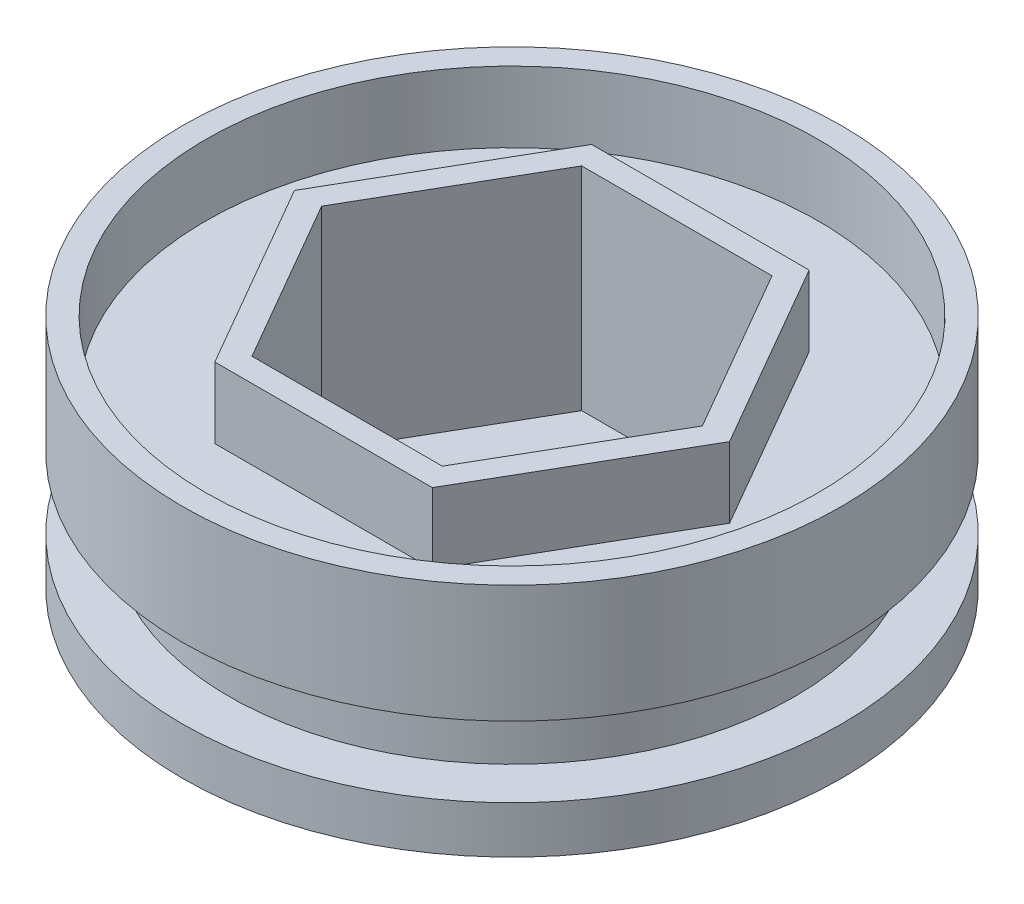
ISO-10303-21;
HEADER;
FILE_DESCRIPTION(('STEP AP214'),'2;1');
FILE_NAME('part.step','',(''),(''),'','','');
FILE_SCHEMA(('AUTOMOTIVE_DESIGN { 1 0 10303 214 1 1 1 1 }'));
ENDSEC;
DATA;
#1=APPLICATION_CONTEXT('core data for automotive mechanical design processes');
#2=APPLICATION_PROTOCOL_DEFINITION('international standard','automotive_design',2000,#1);
#3=PRODUCT_CONTEXT('',#1,'mechanical');
#4=PRODUCT('Part','Part','',(#3));
#5=PRODUCT_RELATED_PRODUCT_CATEGORY('part','',(#4));
#6=PRODUCT_DEFINITION_FORMATION('','',#4);
#7=PRODUCT_DEFINITION_CONTEXT('part definition',#1,'design');
#8=PRODUCT_DEFINITION('design','',#6,#7);
#9=PRODUCT_DEFINITION_SHAPE('','',#8);
#10=(LENGTH_UNIT() NAMED_UNIT(*) SI_UNIT(.MILLI.,.METRE.));
#11=(NAMED_UNIT(*) PLANE_ANGLE_UNIT() SI_UNIT($,.RADIAN.));
#12=(NAMED_UNIT(*) SI_UNIT($,.STERADIAN.) SOLID_ANGLE_UNIT());
#13=UNCERTAINTY_MEASURE_WITH_UNIT(LENGTH_MEASURE(1.E-05),#10,'distance_accuracy_value','');
#14=(GEOMETRIC_REPRESENTATION_CONTEXT(3) GLOBAL_UNCERTAINTY_ASSIGNED_CONTEXT((#13)) GLOBAL_UNIT_ASSIGNED_CONTEXT((#10,
#11,#12)) REPRESENTATION_CONTEXT('',''));
#15=CARTESIAN_POINT('',(0.,0.,0.));
#16=DIRECTION('',(0.,0.,1.));
#17=DIRECTION('',(1.,0.,0.));
#18=AXIS2_PLACEMENT_3D('',#15,#16,#17);
#19=CARTESIAN_POINT('',(0.,9.99999999999996,0.));
#20=DIRECTION('',(0.,-1.,0.));
#21=DIRECTION('',(0.,0.,-1.));
#22=AXIS2_PLACEMENT_3D('',#19,#20,#21);
#23=CYLINDRICAL_SURFACE('',#22,14.);
#24=CARTESIAN_POINT('',(0.,9.99999999999996,0.));
#25=DIRECTION('',(0.,1.,0.));
#26=DIRECTION('',(0.,0.,1.));
#27=AXIS2_PLACEMENT_3D('',#24,#25,#26);
#28=CIRCLE('',#27,14.);
#29=CARTESIAN_POINT('',(0.,9.99999999999996,14.));
#30=VERTEX_POINT('',#29);
#31=EDGE_CURVE('E13',#30,#30,#28,.T.);
#32=ORIENTED_EDGE('',*,*,#31,.F.);
#33=EDGE_LOOP('',(#32));
#34=FACE_BOUND('',#33,.T.);
#35=CARTESIAN_POINT('',(0.,4.99999999999996,0.));
#36=DIRECTION('',(0.,1.,0.));
#37=DIRECTION('',(1.,0.,0.));
#38=AXIS2_PLACEMENT_3D('',#35,#36,#37);
#39=CIRCLE('',#38,14.);
#40=CARTESIAN_POINT('',(14.,4.99999999999997,0.));
#41=VERTEX_POINT('',#40);
#42=EDGE_CURVE('E154',#41,#41,#39,.T.);
#43=ORIENTED_EDGE('',*,*,#42,.T.);
#44=EDGE_LOOP('',(#43));
#45=FACE_BOUND('',#44,.T.);
#46=ADVANCED_FACE('F52',(#34,#45),#23,.T.);
#47=CARTESIAN_POINT('',(0.,6.99999999999996,0.));
#48=DIRECTION('',(0.,1.,0.));
#49=DIRECTION('',(0.,0.,1.));
#50=AXIS2_PLACEMENT_3D('',#47,#48,#49);
#51=PLANE('',#50);
#52=CARTESIAN_POINT('',(0.,6.99999999999996,0.));
#53=DIRECTION('',(0.,1.,0.));
#54=DIRECTION('',(0.,0.,1.));
#55=AXIS2_PLACEMENT_3D('',#52,#53,#54);
#56=CIRCLE('',#55,13.);
#57=CARTESIAN_POINT('',(0.,6.99999999999996,13.));
#58=VERTEX_POINT('',#57);
#59=EDGE_CURVE('E259',#58,#58,#56,.T.);
#60=ORIENTED_EDGE('',*,*,#59,.T.);
#61=EDGE_LOOP('',(#60));
#62=FACE_BOUND('',#61,.T.);
#63=DIRECTION('',(-0.5,0.,-0.866025403784439));
#64=VECTOR('',#63,1.);
#65=CARTESIAN_POINT('',(9.23760430703402,6.99999999999996,0.));
#66=LINE('',#65,#64);
#67=CARTESIAN_POINT('',(9.23760430703402,6.99999999999996,0.));
#68=VERTEX_POINT('',#67);
#69=CARTESIAN_POINT('',(4.61880215351702,6.99999999999996,-8.));
#70=VERTEX_POINT('',#69);
#71=EDGE_CURVE('E233',#68,#70,#66,.T.);
#72=ORIENTED_EDGE('',*,*,#71,.F.);
#73=DIRECTION('',(0.500000000000002,0.,-0.866025403784441));
#74=VECTOR('',#73,1.);
#75=CARTESIAN_POINT('',(4.61880215351701,6.99999999999998,8.00000000000001));
#76=LINE('',#75,#74);
#77=CARTESIAN_POINT('',(4.61880215351701,6.99999999999998,8.00000000000001));
#78=VERTEX_POINT('',#77);
#79=EDGE_CURVE('E205',#78,#68,#76,.T.);
#80=ORIENTED_EDGE('',*,*,#79,.F.);
#81=DIRECTION('',(1.,0.,0.));
#82=VECTOR('',#81,1.);
#83=CARTESIAN_POINT('',(-4.61880215351707,6.99999999999998,8.00000000000005));
#84=LINE('',#83,#82);
#85=CARTESIAN_POINT('',(-4.61880215351707,6.99999999999998,8.00000000000005));
#86=VERTEX_POINT('',#85);
#87=EDGE_CURVE('E220',#86,#78,#84,.T.);
#88=ORIENTED_EDGE('',*,*,#87,.F.);
#89=DIRECTION('',(0.5,0.,0.866025403784439));
#90=VECTOR('',#89,1.);
#91=CARTESIAN_POINT('',(-9.23760430703406,6.99999999999996,0.));
#92=LINE('',#91,#90);
#93=CARTESIAN_POINT('',(-9.23760430703406,6.99999999999996,0.));
#94=VERTEX_POINT('',#93);
#95=EDGE_CURVE('E239',#94,#86,#92,.T.);
#96=ORIENTED_EDGE('',*,*,#95,.F.);
#97=DIRECTION('',(-0.500000000000002,0.,0.866025403784441));
#98=VECTOR('',#97,1.);
#99=CARTESIAN_POINT('',(-4.61880215351704,6.99999999999996,-7.99999999999999));
#100=LINE('',#99,#98);
#101=CARTESIAN_POINT('',(-4.61880215351704,6.99999999999996,-7.99999999999999));
#102=VERTEX_POINT('',#101);
#103=EDGE_CURVE('E237',#102,#94,#100,.T.);
#104=ORIENTED_EDGE('',*,*,#103,.F.);
#105=DIRECTION('',(-1.,0.,0.));
#106=VECTOR('',#105,1.);
#107=CARTESIAN_POINT('',(4.61880215351702,6.99999999999996,-8.));
#108=LINE('',#107,#106);
#109=EDGE_CURVE('E235',#70,#102,#108,.T.);
#110=ORIENTED_EDGE('',*,*,#109,.F.);
#111=EDGE_LOOP('',(#72,#80,#88,#96,#104,#110));
#112=FACE_BOUND('',#111,.T.);
#113=ADVANCED_FACE('F270',(#62,#112),#51,.T.);
#114=CARTESIAN_POINT('',(0.,9.99999999999996,0.));
#115=DIRECTION('',(0.,1.,0.));
#116=DIRECTION('',(0.,0.,1.));
#117=AXIS2_PLACEMENT_3D('',#114,#115,#116);
#118=PLANE('',#117);
#119=CARTESIAN_POINT('',(0.,9.99999999999996,0.));
#120=DIRECTION('',(0.,1.,0.));
#121=DIRECTION('',(0.,0.,1.));
#122=AXIS2_PLACEMENT_3D('',#119,#120,#121);
#123=CIRCLE('',#122,13.);
#124=CARTESIAN_POINT('',(0.,9.99999999999996,13.));
#125=VERTEX_POINT('',#124);
#126=EDGE_CURVE('E258',#125,#125,#123,.T.);
#127=ORIENTED_EDGE('',*,*,#126,.F.);
#128=EDGE_LOOP('',(#127));
#129=FACE_BOUND('',#128,.T.);
#130=ORIENTED_EDGE('',*,*,#31,.T.);
#131=EDGE_LOOP('',(#130));
#132=FACE_BOUND('',#131,.T.);
#133=ADVANCED_FACE('F267',(#129,#132),#118,.T.);
#134=CARTESIAN_POINT('',(0.,6.99999999999996,0.));
#135=DIRECTION('',(0.,1.,0.));
#136=DIRECTION('',(0.,0.,1.));
#137=AXIS2_PLACEMENT_3D('',#134,#135,#136);
#138=CYLINDRICAL_SURFACE('',#137,13.);
#139=ORIENTED_EDGE('',*,*,#59,.F.);
#140=EDGE_LOOP('',(#139));
#141=FACE_BOUND('',#140,.T.);
#142=ORIENTED_EDGE('',*,*,#126,.T.);
#143=EDGE_LOOP('',(#142));
#144=FACE_BOUND('',#143,.T.);
#145=ADVANCED_FACE('F265',(#141,#144),#138,.F.);
#146=CARTESIAN_POINT('',(4.61880215351701,9.99999999999998,8.00000000000001));
#147=DIRECTION('',(-0.86602540378444,0.,-0.499999999999999));
#148=DIRECTION('',(-0.500000000000002,0.,0.866025403784441));
#149=AXIS2_PLACEMENT_3D('',#146,#147,#148);
#150=PLANE('',#149);
#151=ORIENTED_EDGE('',*,*,#79,.T.);
#152=DIRECTION('',(0.,-1.,0.));
#153=VECTOR('',#152,1.);
#154=CARTESIAN_POINT('',(9.23760430703402,9.99999999999996,0.));
#155=LINE('',#154,#153);
#156=CARTESIAN_POINT('',(9.23760430703402,9.99999999999996,0.));
#157=VERTEX_POINT('',#156);
#158=EDGE_CURVE('E256',#157,#68,#155,.T.);
#159=ORIENTED_EDGE('',*,*,#158,.F.);
#160=DIRECTION('',(0.500000000000002,0.,-0.866025403784441));
#161=VECTOR('',#160,1.);
#162=CARTESIAN_POINT('',(4.61880215351701,9.99999999999998,8.00000000000001));
#163=LINE('',#162,#161);
#164=CARTESIAN_POINT('',(4.61880215351701,9.99999999999998,8.00000000000001));
#165=VERTEX_POINT('',#164);
#166=EDGE_CURVE('E216',#165,#157,#163,.T.);
#167=ORIENTED_EDGE('',*,*,#166,.F.);
#168=DIRECTION('',(0.,-1.,0.));
#169=VECTOR('',#168,1.);
#170=CARTESIAN_POINT('',(4.61880215351701,9.99999999999998,8.00000000000001));
#171=LINE('',#170,#169);
#172=EDGE_CURVE('E230',#165,#78,#171,.T.);
#173=ORIENTED_EDGE('',*,*,#172,.T.);
#174=EDGE_LOOP('',(#151,#159,#167,#173));
#175=FACE_BOUND('',#174,.T.);
#176=ADVANCED_FACE('F297',(#175),#150,.F.);
#177=CARTESIAN_POINT('',(9.23760430703402,9.99999999999996,0.));
#178=DIRECTION('',(-0.866025403784442,0.,0.500000000000002));
#179=DIRECTION('',(0.5,0.,0.866025403784439));
#180=AXIS2_PLACEMENT_3D('',#177,#178,#179);
#181=PLANE('',#180);
#182=ORIENTED_EDGE('',*,*,#71,.T.);
#183=DIRECTION('',(0.,-1.,0.));
#184=VECTOR('',#183,1.);
#185=CARTESIAN_POINT('',(4.61880215351702,9.99999999999996,-8.));
#186=LINE('',#185,#184);
#187=CARTESIAN_POINT('',(4.61880215351702,9.99999999999996,-8.));
#188=VERTEX_POINT('',#187);
#189=EDGE_CURVE('E253',#188,#70,#186,.T.);
#190=ORIENTED_EDGE('',*,*,#189,.F.);
#191=DIRECTION('',(-0.5,0.,-0.866025403784439));
#192=VECTOR('',#191,1.);
#193=CARTESIAN_POINT('',(9.23760430703402,9.99999999999996,0.));
#194=LINE('',#193,#192);
#195=EDGE_CURVE('E219',#157,#188,#194,.T.);
#196=ORIENTED_EDGE('',*,*,#195,.F.);
#197=ORIENTED_EDGE('',*,*,#158,.T.);
#198=EDGE_LOOP('',(#182,#190,#196,#197));
#199=FACE_BOUND('',#198,.T.);
#200=ADVANCED_FACE('F304',(#199),#181,.F.);
#201=CARTESIAN_POINT('',(4.61880215351702,9.99999999999996,-8.));
#202=DIRECTION('',(0.,0.,1.));
#203=DIRECTION('',(1.,0.,0.));
#204=AXIS2_PLACEMENT_3D('',#201,#202,#203);
#205=PLANE('',#204);
#206=ORIENTED_EDGE('',*,*,#109,.T.);
#207=DIRECTION('',(0.,-1.,0.));
#208=VECTOR('',#207,1.);
#209=CARTESIAN_POINT('',(-4.61880215351704,9.99999999999996,-7.99999999999999));
#210=LINE('',#209,#208);
#211=CARTESIAN_POINT('',(-4.61880215351704,9.99999999999996,-7.99999999999999));
#212=VERTEX_POINT('',#211);
#213=EDGE_CURVE('E250',#212,#102,#210,.T.);
#214=ORIENTED_EDGE('',*,*,#213,.F.);
#215=DIRECTION('',(-1.,0.,0.));
#216=VECTOR('',#215,1.);
#217=CARTESIAN_POINT('',(4.61880215351702,9.99999999999996,-8.));
#218=LINE('',#217,#216);
#219=EDGE_CURVE('E222',#188,#212,#218,.T.);
#220=ORIENTED_EDGE('',*,*,#219,.F.);
#221=ORIENTED_EDGE('',*,*,#189,.T.);
#222=EDGE_LOOP('',(#206,#214,#220,#221));
#223=FACE_BOUND('',#222,.T.);
#224=ADVANCED_FACE('F308',(#223),#205,.F.);
#225=CARTESIAN_POINT('',(-4.61880215351704,9.99999999999996,-7.99999999999999));
#226=DIRECTION('',(0.866025403784441,0.,0.499999999999999));
#227=DIRECTION('',(0.500000000000002,0.,-0.866025403784441));
#228=AXIS2_PLACEMENT_3D('',#225,#226,#227);
#229=PLANE('',#228);
#230=ORIENTED_EDGE('',*,*,#103,.T.);
#231=DIRECTION('',(0.,-1.,0.));
#232=VECTOR('',#231,1.);
#233=CARTESIAN_POINT('',(-9.23760430703402,9.99999999999996,0.));
#234=LINE('',#233,#232);
#235=CARTESIAN_POINT('',(-9.23760430703402,9.99999999999996,0.));
#236=VERTEX_POINT('',#235);
#237=EDGE_CURVE('E247',#236,#94,#234,.T.);
#238=ORIENTED_EDGE('',*,*,#237,.F.);
#239=DIRECTION('',(-0.500000000000002,0.,0.866025403784441));
#240=VECTOR('',#239,1.);
#241=CARTESIAN_POINT('',(-4.61880215351704,9.99999999999996,-7.99999999999999));
#242=LINE('',#241,#240);
#243=EDGE_CURVE('E224',#212,#236,#242,.T.);
#244=ORIENTED_EDGE('',*,*,#243,.F.);
#245=ORIENTED_EDGE('',*,*,#213,.T.);
#246=EDGE_LOOP('',(#230,#238,#244,#245));
#247=FACE_BOUND('',#246,.T.);
#248=ADVANCED_FACE('F312',(#247),#229,.F.);
#249=CARTESIAN_POINT('',(-9.23760430703402,9.99999999999996,0.));
#250=DIRECTION('',(0.866025403784442,0.,-0.500000000000002));
#251=DIRECTION('',(-0.500000000000001,0.,-0.86602540378444));
#252=AXIS2_PLACEMENT_3D('',#249,#250,#251);
#253=PLANE('',#252);
#254=ORIENTED_EDGE('',*,*,#95,.T.);
#255=DIRECTION('',(0.,-1.,0.));
#256=VECTOR('',#255,1.);
#257=CARTESIAN_POINT('',(-4.61880215351707,9.99999999999998,8.00000000000005));
#258=LINE('',#257,#256);
#259=CARTESIAN_POINT('',(-4.61880215351707,9.99999999999998,8.00000000000005));
#260=VERTEX_POINT('',#259);
#261=EDGE_CURVE('E245',#260,#86,#258,.T.);
#262=ORIENTED_EDGE('',*,*,#261,.F.);
#263=DIRECTION('',(0.5,0.,0.866025403784439));
#264=VECTOR('',#263,1.);
#265=CARTESIAN_POINT('',(-9.23760430703402,9.99999999999996,0.));
#266=LINE('',#265,#264);
#267=EDGE_CURVE('E226',#236,#260,#266,.T.);
#268=ORIENTED_EDGE('',*,*,#267,.F.);
#269=ORIENTED_EDGE('',*,*,#237,.T.);
#270=EDGE_LOOP('',(#254,#262,#268,#269));
#271=FACE_BOUND('',#270,.T.);
#272=ADVANCED_FACE('F316',(#271),#253,.F.);
#273=CARTESIAN_POINT('',(-4.61880215351707,9.99999999999998,8.00000000000005));
#274=DIRECTION('',(0.,0.,-1.));
#275=DIRECTION('',(-1.,0.,0.));
#276=AXIS2_PLACEMENT_3D('',#273,#274,#275);
#277=PLANE('',#276);
#278=ORIENTED_EDGE('',*,*,#87,.T.);
#279=ORIENTED_EDGE('',*,*,#172,.F.);
#280=DIRECTION('',(1.,0.,0.));
#281=VECTOR('',#280,1.);
#282=CARTESIAN_POINT('',(-4.61880215351707,9.99999999999998,8.00000000000005));
#283=LINE('',#282,#281);
#284=EDGE_CURVE('E228',#260,#165,#283,.T.);
#285=ORIENTED_EDGE('',*,*,#284,.F.);
#286=ORIENTED_EDGE('',*,*,#261,.T.);
#287=EDGE_LOOP('',(#278,#279,#285,#286));
#288=FACE_BOUND('',#287,.T.);
#289=ADVANCED_FACE('F320',(#288),#277,.F.);
#290=CARTESIAN_POINT('',(0.,9.99999999999996,0.));
#291=DIRECTION('',(0.,1.,0.));
#292=DIRECTION('',(0.,0.,1.));
#293=AXIS2_PLACEMENT_3D('',#290,#291,#292);
#294=PLANE('',#293);
#295=DIRECTION('',(0.500000000000002,0.,-0.86602540378444));
#296=VECTOR('',#295,1.);
#297=CARTESIAN_POINT('',(4.04145188432738,9.99999999999998,7.00000000000004));
#298=LINE('',#297,#296);
#299=CARTESIAN_POINT('',(4.04145188432738,9.99999999999998,7.00000000000004));
#300=VERTEX_POINT('',#299);
#301=CARTESIAN_POINT('',(8.08290376865477,9.99999999999996,0.));
#302=VERTEX_POINT('',#301);
#303=EDGE_CURVE('E166',#300,#302,#298,.T.);
#304=ORIENTED_EDGE('',*,*,#303,.F.);
#305=DIRECTION('',(1.,0.,0.));
#306=VECTOR('',#305,1.);
#307=CARTESIAN_POINT('',(-4.04145188432742,9.99999999999998,7.00000000000004));
#308=LINE('',#307,#306);
#309=CARTESIAN_POINT('',(-4.04145188432742,9.99999999999998,7.00000000000004));
#310=VERTEX_POINT('',#309);
#311=EDGE_CURVE('E172',#310,#300,#308,.T.);
#312=ORIENTED_EDGE('',*,*,#311,.F.);
#313=DIRECTION('',(0.500000000000001,0.,0.866025403784439));
#314=VECTOR('',#313,1.);
#315=CARTESIAN_POINT('',(-8.08290376865481,9.99999999999996,0.));
#316=LINE('',#315,#314);
#317=CARTESIAN_POINT('',(-8.08290376865481,9.99999999999996,0.));
#318=VERTEX_POINT('',#317);
#319=EDGE_CURVE('E198',#318,#310,#316,.T.);
#320=ORIENTED_EDGE('',*,*,#319,.F.);
#321=DIRECTION('',(-0.500000000000002,0.,0.866025403784441));
#322=VECTOR('',#321,1.);
#323=CARTESIAN_POINT('',(-4.04145188432742,9.99999999999996,-6.99999999999999));
#324=LINE('',#323,#322);
#325=CARTESIAN_POINT('',(-4.04145188432742,9.99999999999996,-6.99999999999999));
#326=VERTEX_POINT('',#325);
#327=EDGE_CURVE('E195',#326,#318,#324,.T.);
#328=ORIENTED_EDGE('',*,*,#327,.F.);
#329=DIRECTION('',(-1.,0.,0.));
#330=VECTOR('',#329,1.);
#331=CARTESIAN_POINT('',(4.04145188432738,9.99999999999996,-7.));
#332=LINE('',#331,#330);
#333=CARTESIAN_POINT('',(4.04145188432738,9.99999999999996,-7.));
#334=VERTEX_POINT('',#333);
#335=EDGE_CURVE('E192',#334,#326,#332,.T.);
#336=ORIENTED_EDGE('',*,*,#335,.F.);
#337=DIRECTION('',(-0.500000000000001,0.,-0.866025403784439));
#338=VECTOR('',#337,1.);
#339=CARTESIAN_POINT('',(8.08290376865477,9.99999999999996,0.));
#340=LINE('',#339,#338);
#341=EDGE_CURVE('E189',#302,#334,#340,.T.);
#342=ORIENTED_EDGE('',*,*,#341,.F.);
#343=EDGE_LOOP('',(#304,#312,#320,#328,#336,#342));
#344=FACE_BOUND('',#343,.T.);
#345=ORIENTED_EDGE('',*,*,#166,.T.);
#346=ORIENTED_EDGE('',*,*,#195,.T.);
#347=ORIENTED_EDGE('',*,*,#219,.T.);
#348=ORIENTED_EDGE('',*,*,#243,.T.);
#349=ORIENTED_EDGE('',*,*,#267,.T.);
#350=ORIENTED_EDGE('',*,*,#284,.T.);
#351=EDGE_LOOP('',(#345,#346,#347,#348,#349,#350));
#352=FACE_BOUND('',#351,.T.);
#353=ADVANCED_FACE('F324',(#344,#352),#294,.T.);
#354=CARTESIAN_POINT('',(4.04145188432738,1.,7.00000000000002));
#355=DIRECTION('',(0.86602540378444,0.,0.5));
#356=DIRECTION('',(0.500000000000002,0.,-0.866025403784441));
#357=AXIS2_PLACEMENT_3D('',#354,#355,#356);
#358=PLANE('',#357);
#359=ORIENTED_EDGE('',*,*,#303,.T.);
#360=DIRECTION('',(0.,1.,0.));
#361=VECTOR('',#360,1.);
#362=CARTESIAN_POINT('',(8.08290376865477,1.,0.));
#363=LINE('',#362,#361);
#364=CARTESIAN_POINT('',(8.08290376865477,1.,0.));
#365=VERTEX_POINT('',#364);
#366=EDGE_CURVE('E187',#365,#302,#363,.T.);
#367=ORIENTED_EDGE('',*,*,#366,.F.);
#368=DIRECTION('',(0.500000000000002,0.,-0.86602540378444));
#369=VECTOR('',#368,1.);
#370=CARTESIAN_POINT('',(4.04145188432738,1.,7.00000000000002));
#371=LINE('',#370,#369);
#372=CARTESIAN_POINT('',(4.04145188432738,1.,7.00000000000002));
#373=VERTEX_POINT('',#372);
#374=EDGE_CURVE('E168',#373,#365,#371,.T.);
#375=ORIENTED_EDGE('',*,*,#374,.F.);
#376=DIRECTION('',(0.,1.,0.));
#377=VECTOR('',#376,1.);
#378=CARTESIAN_POINT('',(4.04145188432738,1.,7.00000000000002));
#379=LINE('',#378,#377);
#380=EDGE_CURVE('E203',#373,#300,#379,.T.);
#381=ORIENTED_EDGE('',*,*,#380,.T.);
#382=EDGE_LOOP('',(#359,#367,#375,#381));
#383=FACE_BOUND('',#382,.T.);
#384=ADVANCED_FACE('F328',(#383),#358,.F.);
#385=CARTESIAN_POINT('',(-4.04145188432743,0.999999999999959,7.00000000000004));
#386=DIRECTION('',(0.,0.,1.));
#387=DIRECTION('',(1.,0.,0.));
#388=AXIS2_PLACEMENT_3D('',#385,#386,#387);
#389=PLANE('',#388);
#390=ORIENTED_EDGE('',*,*,#311,.T.);
#391=ORIENTED_EDGE('',*,*,#380,.F.);
#392=DIRECTION('',(1.,0.,0.));
#393=VECTOR('',#392,1.);
#394=CARTESIAN_POINT('',(-4.04145188432743,0.999999999999959,7.00000000000004));
#395=LINE('',#394,#393);
#396=CARTESIAN_POINT('',(-4.04145188432743,0.999999999999959,7.00000000000004));
#397=VERTEX_POINT('',#396);
#398=EDGE_CURVE('E184',#397,#373,#395,.T.);
#399=ORIENTED_EDGE('',*,*,#398,.F.);
#400=DIRECTION('',(0.,1.,0.));
#401=VECTOR('',#400,1.);
#402=CARTESIAN_POINT('',(-4.04145188432743,0.999999999999959,7.00000000000004));
#403=LINE('',#402,#401);
#404=EDGE_CURVE('E206',#397,#310,#403,.T.);
#405=ORIENTED_EDGE('',*,*,#404,.T.);
#406=EDGE_LOOP('',(#390,#391,#399,#405));
#407=FACE_BOUND('',#406,.T.);
#408=ADVANCED_FACE('F332',(#407),#389,.F.);
#409=CARTESIAN_POINT('',(-8.08290376865481,0.999999999999959,0.));
#410=DIRECTION('',(-0.866025403784442,0.,0.500000000000002));
#411=DIRECTION('',(0.500000000000001,0.,0.86602540378444));
#412=AXIS2_PLACEMENT_3D('',#409,#410,#411);
#413=PLANE('',#412);
#414=ORIENTED_EDGE('',*,*,#319,.T.);
#415=ORIENTED_EDGE('',*,*,#404,.F.);
#416=DIRECTION('',(0.500000000000001,0.,0.866025403784439));
#417=VECTOR('',#416,1.);
#418=CARTESIAN_POINT('',(-8.08290376865481,0.999999999999959,0.));
#419=LINE('',#418,#417);
#420=CARTESIAN_POINT('',(-8.08290376865481,0.999999999999959,0.));
#421=VERTEX_POINT('',#420);
#422=EDGE_CURVE('E181',#421,#397,#419,.T.);
#423=ORIENTED_EDGE('',*,*,#422,.F.);
#424=DIRECTION('',(0.,1.,0.));
#425=VECTOR('',#424,1.);
#426=CARTESIAN_POINT('',(-8.08290376865481,0.999999999999959,0.));
#427=LINE('',#426,#425);
#428=EDGE_CURVE('E208',#421,#318,#427,.T.);
#429=ORIENTED_EDGE('',*,*,#428,.T.);
#430=EDGE_LOOP('',(#414,#415,#423,#429));
#431=FACE_BOUND('',#430,.T.);
#432=ADVANCED_FACE('F346',(#431),#413,.F.);
#433=CARTESIAN_POINT('',(-4.04145188432742,1.,-6.99999999999999));
#434=DIRECTION('',(-0.866025403784441,0.,-0.499999999999999));
#435=DIRECTION('',(-0.500000000000002,0.,0.866025403784441));
#436=AXIS2_PLACEMENT_3D('',#433,#434,#435);
#437=PLANE('',#436);
#438=ORIENTED_EDGE('',*,*,#327,.T.);
#439=ORIENTED_EDGE('',*,*,#428,.F.);
#440=DIRECTION('',(-0.500000000000002,0.,0.866025403784441));
#441=VECTOR('',#440,1.);
#442=CARTESIAN_POINT('',(-4.04145188432742,1.,-6.99999999999999));
#443=LINE('',#442,#441);
#444=CARTESIAN_POINT('',(-4.04145188432742,1.,-6.99999999999999));
#445=VERTEX_POINT('',#444);
#446=EDGE_CURVE('E178',#445,#421,#443,.T.);
#447=ORIENTED_EDGE('',*,*,#446,.F.);
#448=DIRECTION('',(0.,1.,0.));
#449=VECTOR('',#448,1.);
#450=CARTESIAN_POINT('',(-4.04145188432742,1.,-6.99999999999999));
#451=LINE('',#450,#449);
#452=EDGE_CURVE('E210',#445,#326,#451,.T.);
#453=ORIENTED_EDGE('',*,*,#452,.T.);
#454=EDGE_LOOP('',(#438,#439,#447,#453));
#455=FACE_BOUND('',#454,.T.);
#456=ADVANCED_FACE('F342',(#455),#437,.F.);
#457=CARTESIAN_POINT('',(4.04145188432738,1.,-7.));
#458=DIRECTION('',(0.,0.,-1.));
#459=DIRECTION('',(-1.,0.,0.));
#460=AXIS2_PLACEMENT_3D('',#457,#458,#459);
#461=PLANE('',#460);
#462=ORIENTED_EDGE('',*,*,#335,.T.);
#463=ORIENTED_EDGE('',*,*,#452,.F.);
#464=DIRECTION('',(-1.,0.,0.));
#465=VECTOR('',#464,1.);
#466=CARTESIAN_POINT('',(4.04145188432738,1.,-7.));
#467=LINE('',#466,#465);
#468=CARTESIAN_POINT('',(4.04145188432738,1.,-7.));
#469=VERTEX_POINT('',#468);
#470=EDGE_CURVE('E175',#469,#445,#467,.T.);
#471=ORIENTED_EDGE('',*,*,#470,.F.);
#472=DIRECTION('',(0.,1.,0.));
#473=VECTOR('',#472,1.);
#474=CARTESIAN_POINT('',(4.04145188432738,1.,-7.));
#475=LINE('',#474,#473);
#476=EDGE_CURVE('E212',#469,#334,#475,.T.);
#477=ORIENTED_EDGE('',*,*,#476,.T.);
#478=EDGE_LOOP('',(#462,#463,#471,#477));
#479=FACE_BOUND('',#478,.T.);
#480=ADVANCED_FACE('F338',(#479),#461,.F.);
#481=CARTESIAN_POINT('',(8.08290376865477,1.,0.));
#482=DIRECTION('',(0.866025403784441,0.,-0.500000000000002));
#483=DIRECTION('',(-0.5,0.,-0.866025403784439));
#484=AXIS2_PLACEMENT_3D('',#481,#482,#483);
#485=PLANE('',#484);
#486=ORIENTED_EDGE('',*,*,#341,.T.);
#487=ORIENTED_EDGE('',*,*,#476,.F.);
#488=DIRECTION('',(-0.500000000000001,0.,-0.866025403784439));
#489=VECTOR('',#488,1.);
#490=CARTESIAN_POINT('',(8.08290376865477,1.,0.));
#491=LINE('',#490,#489);
#492=EDGE_CURVE('E171',#365,#469,#491,.T.);
#493=ORIENTED_EDGE('',*,*,#492,.F.);
#494=ORIENTED_EDGE('',*,*,#366,.T.);
#495=EDGE_LOOP('',(#486,#487,#493,#494));
#496=FACE_BOUND('',#495,.T.);
#497=ADVANCED_FACE('F334',(#496),#485,.F.);
#498=CARTESIAN_POINT('',(0.,1.,0.));
#499=DIRECTION('',(0.,1.,0.));
#500=DIRECTION('',(0.,0.,1.));
#501=AXIS2_PLACEMENT_3D('',#498,#499,#500);
#502=PLANE('',#501);
#503=ORIENTED_EDGE('',*,*,#374,.T.);
#504=ORIENTED_EDGE('',*,*,#492,.T.);
#505=ORIENTED_EDGE('',*,*,#470,.T.);
#506=ORIENTED_EDGE('',*,*,#446,.T.);
#507=ORIENTED_EDGE('',*,*,#422,.T.);
#508=ORIENTED_EDGE('',*,*,#398,.T.);
#509=EDGE_LOOP('',(#503,#504,#505,#506,#507,#508));
#510=FACE_BOUND('',#509,.T.);
#511=ADVANCED_FACE('F337',(#510),#502,.T.);
#512=CARTESIAN_POINT('',(14.,4.99999999999997,0.));
#513=DIRECTION('',(0.,-1.,0.));
#514=DIRECTION('',(0.,0.,-1.));
#515=AXIS2_PLACEMENT_3D('',#512,#513,#514);
#516=PLANE('',#515);
#517=CARTESIAN_POINT('',(0.,4.99999999999996,0.));
#518=DIRECTION('',(0.,1.,0.));
#519=DIRECTION('',(1.,0.,0.));
#520=AXIS2_PLACEMENT_3D('',#517,#518,#519);
#521=CIRCLE('',#520,12.);
#522=CARTESIAN_POINT('',(12.0000000000001,4.99999999999997,0.));
#523=VERTEX_POINT('',#522);
#524=EDGE_CURVE('E152',#523,#523,#521,.T.);
#525=ORIENTED_EDGE('',*,*,#524,.T.);
#526=EDGE_LOOP('',(#525));
#527=FACE_BOUND('',#526,.T.);
#528=ORIENTED_EDGE('',*,*,#42,.F.);
#529=EDGE_LOOP('',(#528));
#530=FACE_BOUND('',#529,.T.);
#531=ADVANCED_FACE('F150',(#527,#530),#516,.T.);
#532=CARTESIAN_POINT('',(0.,3.49999999999996,0.));
#533=DIRECTION('',(0.,1.,0.));
#534=DIRECTION('',(0.,0.,1.));
#535=AXIS2_PLACEMENT_3D('',#532,#533,#534);
#536=CYLINDRICAL_SURFACE('',#535,12.);
#537=DIRECTION('',(0.,-1.,0.));
#538=VECTOR('',#537,1.);
#539=CARTESIAN_POINT('',(12.,1.99999999999996,0.));
#540=LINE('',#539,#538);
#541=CARTESIAN_POINT('',(12.,1.99999999999996,0.));
#542=VERTEX_POINT('',#541);
#543=EDGE_CURVE('E155',#523,#542,#540,.T.);
#544=ORIENTED_EDGE('',*,*,#543,.F.);
#545=ORIENTED_EDGE('',*,*,#524,.F.);
#546=ORIENTED_EDGE('',*,*,#543,.T.);
#547=CARTESIAN_POINT('',(0.,1.99999999999996,0.));
#548=DIRECTION('',(0.,1.,0.));
#549=DIRECTION('',(1.,0.,0.));
#550=AXIS2_PLACEMENT_3D('',#547,#548,#549);
#551=CIRCLE('',#550,12.);
#552=EDGE_CURVE('E162',#542,#542,#551,.T.);
#553=ORIENTED_EDGE('',*,*,#552,.T.);
#554=EDGE_LOOP('',(#544,#545,#546,#553));
#555=FACE_BOUND('',#554,.T.);
#556=ADVANCED_FACE('F292',(#555),#536,.T.);
#557=CARTESIAN_POINT('',(14.,1.99999999999996,0.));
#558=DIRECTION('',(0.,1.,0.));
#559=DIRECTION('',(0.,0.,1.));
#560=AXIS2_PLACEMENT_3D('',#557,#558,#559);
#561=PLANE('',#560);
#562=CARTESIAN_POINT('',(0.,1.99999999999996,0.));
#563=DIRECTION('',(0.,1.,0.));
#564=DIRECTION('',(1.,0.,0.));
#565=AXIS2_PLACEMENT_3D('',#562,#563,#564);
#566=CIRCLE('',#565,14.);
#567=CARTESIAN_POINT('',(14.,1.99999999999997,0.));
#568=VERTEX_POINT('',#567);
#569=EDGE_CURVE('E160',#568,#568,#566,.T.);
#570=ORIENTED_EDGE('',*,*,#569,.T.);
#571=EDGE_LOOP('',(#570));
#572=FACE_BOUND('',#571,.T.);
#573=ORIENTED_EDGE('',*,*,#552,.F.);
#574=EDGE_LOOP('',(#573));
#575=FACE_BOUND('',#574,.T.);
#576=ADVANCED_FACE('F278',(#572,#575),#561,.T.);
#577=CARTESIAN_POINT('',(0.,0.,0.));
#578=DIRECTION('',(0.,1.,0.));
#579=DIRECTION('',(0.,0.,1.));
#580=AXIS2_PLACEMENT_3D('',#577,#578,#579);
#581=PLANE('',#580);
#582=CARTESIAN_POINT('',(0.,0.,0.));
#583=DIRECTION('',(0.,1.,0.));
#584=DIRECTION('',(0.,0.,1.));
#585=AXIS2_PLACEMENT_3D('',#582,#583,#584);
#586=CIRCLE('',#585,14.);
#587=CARTESIAN_POINT('',(0.,0.,14.));
#588=VERTEX_POINT('',#587);
#589=EDGE_CURVE('E55',#588,#588,#586,.T.);
#590=ORIENTED_EDGE('',*,*,#589,.F.);
#591=EDGE_LOOP('',(#590));
#592=FACE_BOUND('',#591,.T.);
#593=ADVANCED_FACE('F281',(#592),#581,.F.);
#594=ORIENTED_EDGE('',*,*,#589,.T.);
#595=EDGE_LOOP('',(#594));
#596=FACE_BOUND('',#595,.T.);
#597=ORIENTED_EDGE('',*,*,#569,.F.);
#598=EDGE_LOOP('',(#597));
#599=FACE_BOUND('',#598,.T.);
#600=ADVANCED_FACE('F276',(#596,#599),#23,.T.);
#601=CLOSED_SHELL('',(#46,#113,#133,#145,#176,#200,#224,#248,#272,#289,#353,#384,#408,#432,#456,
#480,#497,#511,#531,#556,#576,#593,#600));
#602=MANIFOLD_SOLID_BREP('B2',#601);
#603=ADVANCED_BREP_SHAPE_REPRESENTATION('',(#18,#602),#14);
#604=SHAPE_DEFINITION_REPRESENTATION(#9,#603);
ENDSEC;
END-ISO-10303-21;
